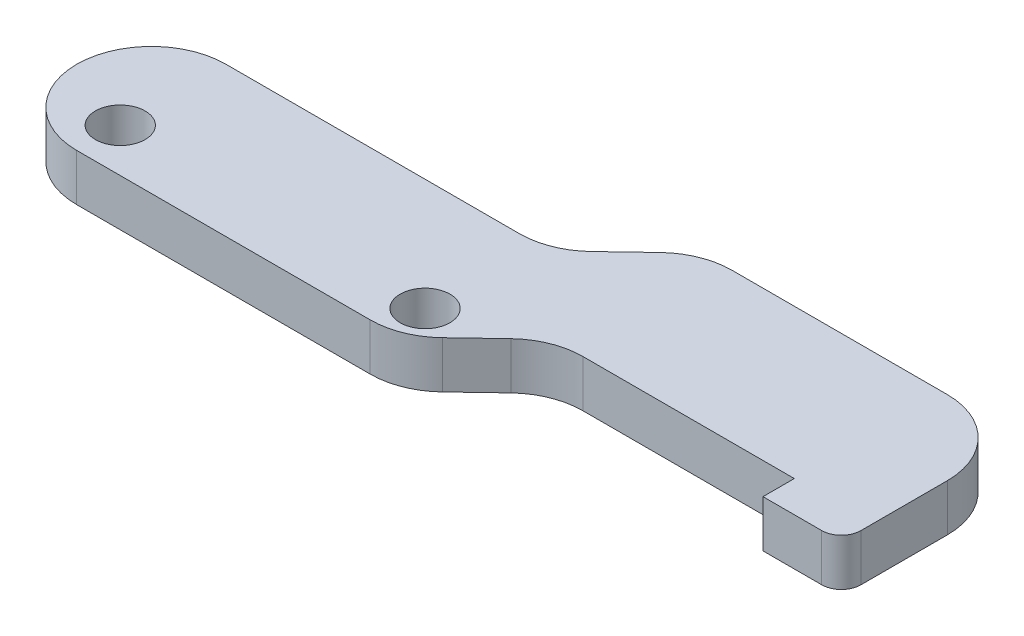
ISO-10303-21;
HEADER;
FILE_DESCRIPTION(('STEP AP214'),'2;1');
FILE_NAME('part.step','',(''),(''),'','','');
FILE_SCHEMA(('AUTOMOTIVE_DESIGN { 1 0 10303 214 1 1 1 1 }'));
ENDSEC;
DATA;
#1=APPLICATION_CONTEXT('core data for automotive mechanical design processes');
#2=APPLICATION_PROTOCOL_DEFINITION('international standard','automotive_design',2000,#1);
#3=PRODUCT_CONTEXT('',#1,'mechanical');
#4=PRODUCT('Part','Part','',(#3));
#5=PRODUCT_RELATED_PRODUCT_CATEGORY('part','',(#4));
#6=PRODUCT_DEFINITION_FORMATION('','',#4);
#7=PRODUCT_DEFINITION_CONTEXT('part definition',#1,'design');
#8=PRODUCT_DEFINITION('design','',#6,#7);
#9=PRODUCT_DEFINITION_SHAPE('','',#8);
#10=(LENGTH_UNIT() NAMED_UNIT(*) SI_UNIT(.MILLI.,.METRE.));
#11=(NAMED_UNIT(*) PLANE_ANGLE_UNIT() SI_UNIT($,.RADIAN.));
#12=(NAMED_UNIT(*) SI_UNIT($,.STERADIAN.) SOLID_ANGLE_UNIT());
#13=UNCERTAINTY_MEASURE_WITH_UNIT(LENGTH_MEASURE(1.E-05),#10,'distance_accuracy_value','');
#14=(GEOMETRIC_REPRESENTATION_CONTEXT(3) GLOBAL_UNCERTAINTY_ASSIGNED_CONTEXT((#13)) GLOBAL_UNIT_ASSIGNED_CONTEXT((#10,
#11,#12)) REPRESENTATION_CONTEXT('',''));
#15=CARTESIAN_POINT('',(0.,0.,0.));
#16=DIRECTION('',(0.,0.,1.));
#17=DIRECTION('',(1.,0.,0.));
#18=AXIS2_PLACEMENT_3D('',#15,#16,#17);
#19=CARTESIAN_POINT('',(0.,37.5,0.));
#20=DIRECTION('',(0.,1.,0.));
#21=DIRECTION('',(0.,0.,1.));
#22=AXIS2_PLACEMENT_3D('',#19,#20,#21);
#23=PLANE('',#22);
#24=CARTESIAN_POINT('',(-257.96875,37.5,0.));
#25=DIRECTION('',(0.,1.,0.));
#26=DIRECTION('',(0.,0.,1.));
#27=AXIS2_PLACEMENT_3D('',#24,#25,#26);
#28=CIRCLE('',#27,19.84375);
#29=CARTESIAN_POINT('',(-257.96875,37.5,19.84375));
#30=VERTEX_POINT('',#29);
#31=EDGE_CURVE('E201',#30,#30,#28,.T.);
#32=ORIENTED_EDGE('',*,*,#31,.F.);
#33=EDGE_LOOP('',(#32));
#34=FACE_BOUND('',#33,.T.);
#35=DIRECTION('',(1.,0.,0.));
#36=VECTOR('',#35,1.);
#37=CARTESIAN_POINT('',(317.5,37.5,0.195312499999996));
#38=LINE('',#37,#36);
#39=CARTESIAN_POINT('',(255.,37.5,0.195312500000003));
#40=VERTEX_POINT('',#39);
#41=CARTESIAN_POINT('',(301.875,37.5,0.195312499999998));
#42=VERTEX_POINT('',#41);
#43=EDGE_CURVE('E181',#40,#42,#38,.T.);
#44=ORIENTED_EDGE('',*,*,#43,.T.);
#45=CARTESIAN_POINT('',(301.875,37.5,-15.4296875));
#46=DIRECTION('',(0.,1.,0.));
#47=DIRECTION('',(0.,0.,1.));
#48=AXIS2_PLACEMENT_3D('',#45,#46,#47);
#49=CIRCLE('',#48,15.625);
#50=CARTESIAN_POINT('',(317.5,37.5,-15.4296875));
#51=VERTEX_POINT('',#50);
#52=EDGE_CURVE('E11',#42,#51,#49,.T.);
#53=ORIENTED_EDGE('',*,*,#52,.T.);
#54=DIRECTION('',(0.,0.,-1.));
#55=VECTOR('',#54,1.);
#56=CARTESIAN_POINT('',(317.5,37.5,-24.8046875));
#57=LINE('',#56,#55);
#58=CARTESIAN_POINT('',(317.5,37.5,-84.3359375));
#59=VERTEX_POINT('',#58);
#60=EDGE_CURVE('E183',#51,#59,#57,.T.);
#61=ORIENTED_EDGE('',*,*,#60,.T.);
#62=CARTESIAN_POINT('',(257.96875,37.5,-84.3359375));
#63=DIRECTION('',(0.,1.,0.));
#64=DIRECTION('',(0.,0.,1.));
#65=AXIS2_PLACEMENT_3D('',#62,#63,#64);
#66=CIRCLE('',#65,59.53125);
#67=CARTESIAN_POINT('',(257.96875,37.5,-143.8671875));
#68=VERTEX_POINT('',#67);
#69=EDGE_CURVE('E248',#59,#68,#66,.T.);
#70=ORIENTED_EDGE('',*,*,#69,.T.);
#71=DIRECTION('',(-1.,0.,0.));
#72=VECTOR('',#71,1.);
#73=CARTESIAN_POINT('',(62.5,37.5,-143.8671875));
#74=LINE('',#73,#72);
#75=CARTESIAN_POINT('',(86.3146553405765,37.5,-143.8671875));
#76=VERTEX_POINT('',#75);
#77=EDGE_CURVE('E188',#68,#76,#74,.T.);
#78=ORIENTED_EDGE('',*,*,#77,.T.);
#79=CARTESIAN_POINT('',(86.3146553405765,37.5,-84.3359375));
#80=DIRECTION('',(0.,1.,0.));
#81=DIRECTION('',(0.,0.,1.));
#82=AXIS2_PLACEMENT_3D('',#79,#80,#81);
#83=CIRCLE('',#82,59.53125);
#84=CARTESIAN_POINT('',(45.2559299992208,37.5,-127.442210824258));
#85=VERTEX_POINT('',#84);
#86=EDGE_CURVE('E250',#76,#85,#83,.T.);
#87=ORIENTED_EDGE('',*,*,#86,.T.);
#88=DIRECTION('',(-0.724094879987533,0.,0.689700373188126));
#89=VECTOR('',#88,1.);
#90=CARTESIAN_POINT('',(0.,37.5,-84.3359375));
#91=LINE('',#90,#89);
#92=CARTESIAN_POINT('',(17.2440700007792,37.5,-100.760914175742));
#93=VERTEX_POINT('',#92);
#94=EDGE_CURVE('E191',#85,#93,#91,.T.);
#95=ORIENTED_EDGE('',*,*,#94,.T.);
#96=CARTESIAN_POINT('',(-23.8146553405764,37.5,-143.8671875));
#97=DIRECTION('',(0.,1.,0.));
#98=DIRECTION('',(0.,0.,1.));
#99=AXIS2_PLACEMENT_3D('',#96,#97,#98);
#100=CIRCLE('',#99,59.53125);
#101=CARTESIAN_POINT('',(-23.8146553405765,37.5,-84.3359375));
#102=VERTEX_POINT('',#101);
#103=EDGE_CURVE('E277',#93,#102,#100,.F.);
#104=ORIENTED_EDGE('',*,*,#103,.T.);
#105=DIRECTION('',(-1.,0.,0.));
#106=VECTOR('',#105,1.);
#107=CARTESIAN_POINT('',(-317.5,37.5,-84.3359375));
#108=LINE('',#107,#106);
#109=CARTESIAN_POINT('',(-257.96875,37.5,-84.3359375));
#110=VERTEX_POINT('',#109);
#111=EDGE_CURVE('E194',#102,#110,#108,.T.);
#112=ORIENTED_EDGE('',*,*,#111,.T.);
#113=CARTESIAN_POINT('',(-257.96875,37.5,-24.8046875));
#114=DIRECTION('',(0.,1.,0.));
#115=DIRECTION('',(0.,0.,1.));
#116=AXIS2_PLACEMENT_3D('',#113,#114,#115);
#117=CIRCLE('',#116,59.53125);
#118=CARTESIAN_POINT('',(-317.5,37.5,-24.8046875));
#119=VERTEX_POINT('',#118);
#120=EDGE_CURVE('E244',#110,#119,#117,.T.);
#121=ORIENTED_EDGE('',*,*,#120,.T.);
#122=CARTESIAN_POINT('',(-257.96875,37.5,-24.8046875));
#123=DIRECTION('',(0.,1.,0.));
#124=DIRECTION('',(0.,0.,1.));
#125=AXIS2_PLACEMENT_3D('',#122,#123,#124);
#126=CIRCLE('',#125,59.53125);
#127=CARTESIAN_POINT('',(-257.96875,37.5,34.7265625));
#128=VERTEX_POINT('',#127);
#129=EDGE_CURVE('E246',#119,#128,#126,.T.);
#130=ORIENTED_EDGE('',*,*,#129,.T.);
#131=DIRECTION('',(1.,0.,0.));
#132=VECTOR('',#131,1.);
#133=CARTESIAN_POINT('',(-317.5,37.5,34.7265625));
#134=LINE('',#133,#132);
#135=CARTESIAN_POINT('',(-23.8146553405765,37.5,34.7265625));
#136=VERTEX_POINT('',#135);
#137=EDGE_CURVE('E220',#128,#136,#134,.T.);
#138=ORIENTED_EDGE('',*,*,#137,.T.);
#139=CARTESIAN_POINT('',(-23.8146553405764,37.5,-24.8046875));
#140=DIRECTION('',(0.,1.,0.));
#141=DIRECTION('',(0.,0.,1.));
#142=AXIS2_PLACEMENT_3D('',#139,#140,#141);
#143=CIRCLE('',#142,59.53125);
#144=CARTESIAN_POINT('',(17.2440700007792,37.5,18.3015858242578));
#145=VERTEX_POINT('',#144);
#146=EDGE_CURVE('E252',#136,#145,#143,.T.);
#147=ORIENTED_EDGE('',*,*,#146,.T.);
#148=DIRECTION('',(0.724094879987533,0.,-0.689700373188125));
#149=VECTOR('',#148,1.);
#150=CARTESIAN_POINT('',(0.,37.5,34.7265625));
#151=LINE('',#150,#149);
#152=CARTESIAN_POINT('',(45.2559299992208,37.5,-8.37971082425783));
#153=VERTEX_POINT('',#152);
#154=EDGE_CURVE('E167',#145,#153,#151,.T.);
#155=ORIENTED_EDGE('',*,*,#154,.T.);
#156=CARTESIAN_POINT('',(86.3146553405764,37.5,34.7265625));
#157=DIRECTION('',(0.,1.,0.));
#158=DIRECTION('',(0.,0.,1.));
#159=AXIS2_PLACEMENT_3D('',#156,#157,#158);
#160=CIRCLE('',#159,59.53125);
#161=CARTESIAN_POINT('',(86.3146553405764,37.5,-24.8046875));
#162=VERTEX_POINT('',#161);
#163=EDGE_CURVE('E163',#153,#162,#160,.F.);
#164=ORIENTED_EDGE('',*,*,#163,.T.);
#165=DIRECTION('',(1.,0.,0.));
#166=VECTOR('',#165,1.);
#167=CARTESIAN_POINT('',(62.5,37.5,-24.8046875));
#168=LINE('',#167,#166);
#169=CARTESIAN_POINT('',(255.,37.5,-24.8046875));
#170=VERTEX_POINT('',#169);
#171=EDGE_CURVE('E155',#162,#170,#168,.T.);
#172=ORIENTED_EDGE('',*,*,#171,.T.);
#173=DIRECTION('',(0.,0.,1.));
#174=VECTOR('',#173,1.);
#175=CARTESIAN_POINT('',(255.,37.5,0.195312500000003));
#176=LINE('',#175,#174);
#177=EDGE_CURVE('E159',#170,#40,#176,.T.);
#178=ORIENTED_EDGE('',*,*,#177,.T.);
#179=EDGE_LOOP('',(#44,#53,#61,#70,#78,#87,#95,#104,#112,#121,#130,#138,#147,#155,#164,#172,#178));
#180=FACE_BOUND('',#179,.T.);
#181=CARTESIAN_POINT('',(-9.83966114808051,37.5,4.9609375));
#182=DIRECTION('',(0.,1.,0.));
#183=DIRECTION('',(0.,0.,1.));
#184=AXIS2_PLACEMENT_3D('',#181,#182,#183);
#185=CIRCLE('',#184,19.84375);
#186=CARTESIAN_POINT('',(-9.83966114808051,37.5,24.8046875));
#187=VERTEX_POINT('',#186);
#188=EDGE_CURVE('E351',#187,#187,#185,.T.);
#189=ORIENTED_EDGE('',*,*,#188,.F.);
#190=EDGE_LOOP('',(#189));
#191=FACE_BOUND('',#190,.T.);
#192=ADVANCED_FACE('F37',(#34,#180,#191),#23,.T.);
#193=CARTESIAN_POINT('',(0.,0.,0.));
#194=DIRECTION('',(0.,1.,0.));
#195=DIRECTION('',(0.,0.,1.));
#196=AXIS2_PLACEMENT_3D('',#193,#194,#195);
#197=PLANE('',#196);
#198=DIRECTION('',(0.,0.,-1.));
#199=VECTOR('',#198,1.);
#200=CARTESIAN_POINT('',(317.5,0.,-24.8046875));
#201=LINE('',#200,#199);
#202=CARTESIAN_POINT('',(317.5,0.,-15.4296875));
#203=VERTEX_POINT('',#202);
#204=CARTESIAN_POINT('',(317.5,0.,-84.3359375));
#205=VERTEX_POINT('',#204);
#206=EDGE_CURVE('E209',#203,#205,#201,.T.);
#207=ORIENTED_EDGE('',*,*,#206,.F.);
#208=CARTESIAN_POINT('',(301.875,0.,-15.4296875));
#209=DIRECTION('',(0.,1.,0.));
#210=DIRECTION('',(0.,0.,1.));
#211=AXIS2_PLACEMENT_3D('',#208,#209,#210);
#212=CIRCLE('',#211,15.625);
#213=CARTESIAN_POINT('',(301.875,0.,0.195312499999998));
#214=VERTEX_POINT('',#213);
#215=EDGE_CURVE('E59',#203,#214,#212,.F.);
#216=ORIENTED_EDGE('',*,*,#215,.T.);
#217=DIRECTION('',(1.,0.,0.));
#218=VECTOR('',#217,1.);
#219=CARTESIAN_POINT('',(317.5,0.,0.195312499999996));
#220=LINE('',#219,#218);
#221=CARTESIAN_POINT('',(255.,0.,0.195312500000003));
#222=VERTEX_POINT('',#221);
#223=EDGE_CURVE('E207',#222,#214,#220,.T.);
#224=ORIENTED_EDGE('',*,*,#223,.F.);
#225=DIRECTION('',(0.,0.,1.));
#226=VECTOR('',#225,1.);
#227=CARTESIAN_POINT('',(255.,0.,0.195312500000003));
#228=LINE('',#227,#226);
#229=CARTESIAN_POINT('',(255.,0.,-24.8046875));
#230=VERTEX_POINT('',#229);
#231=EDGE_CURVE('E205',#230,#222,#228,.T.);
#232=ORIENTED_EDGE('',*,*,#231,.F.);
#233=DIRECTION('',(1.,0.,0.));
#234=VECTOR('',#233,1.);
#235=CARTESIAN_POINT('',(62.5,0.,-24.8046875));
#236=LINE('',#235,#234);
#237=CARTESIAN_POINT('',(86.3146553405764,0.,-24.8046875));
#238=VERTEX_POINT('',#237);
#239=EDGE_CURVE('E173',#238,#230,#236,.T.);
#240=ORIENTED_EDGE('',*,*,#239,.F.);
#241=CARTESIAN_POINT('',(86.3146553405764,0.,34.7265625));
#242=DIRECTION('',(0.,1.,0.));
#243=DIRECTION('',(0.,0.,1.));
#244=AXIS2_PLACEMENT_3D('',#241,#242,#243);
#245=CIRCLE('',#244,59.53125);
#246=CARTESIAN_POINT('',(45.2559299992208,0.,-8.37971082425783));
#247=VERTEX_POINT('',#246);
#248=EDGE_CURVE('E272',#238,#247,#245,.T.);
#249=ORIENTED_EDGE('',*,*,#248,.T.);
#250=DIRECTION('',(0.724094879987533,0.,-0.689700373188125));
#251=VECTOR('',#250,1.);
#252=CARTESIAN_POINT('',(0.,0.,34.7265625));
#253=LINE('',#252,#251);
#254=CARTESIAN_POINT('',(17.2440700007792,0.,18.3015858242578));
#255=VERTEX_POINT('',#254);
#256=EDGE_CURVE('E200',#255,#247,#253,.T.);
#257=ORIENTED_EDGE('',*,*,#256,.F.);
#258=CARTESIAN_POINT('',(-23.8146553405764,0.,-24.8046875));
#259=DIRECTION('',(0.,1.,0.));
#260=DIRECTION('',(0.,0.,1.));
#261=AXIS2_PLACEMENT_3D('',#258,#259,#260);
#262=CIRCLE('',#261,59.53125);
#263=CARTESIAN_POINT('',(-23.8146553405765,0.,34.7265625));
#264=VERTEX_POINT('',#263);
#265=EDGE_CURVE('E237',#255,#264,#262,.F.);
#266=ORIENTED_EDGE('',*,*,#265,.T.);
#267=DIRECTION('',(1.,0.,0.));
#268=VECTOR('',#267,1.);
#269=CARTESIAN_POINT('',(-317.5,0.,34.7265625));
#270=LINE('',#269,#268);
#271=CARTESIAN_POINT('',(-257.96875,0.,34.7265625));
#272=VERTEX_POINT('',#271);
#273=EDGE_CURVE('E197',#272,#264,#270,.T.);
#274=ORIENTED_EDGE('',*,*,#273,.F.);
#275=CARTESIAN_POINT('',(-257.96875,0.,-24.8046875));
#276=DIRECTION('',(0.,1.,0.));
#277=DIRECTION('',(0.,0.,1.));
#278=AXIS2_PLACEMENT_3D('',#275,#276,#277);
#279=CIRCLE('',#278,59.53125);
#280=CARTESIAN_POINT('',(-317.5,0.,-24.8046875));
#281=VERTEX_POINT('',#280);
#282=EDGE_CURVE('E230',#272,#281,#279,.F.);
#283=ORIENTED_EDGE('',*,*,#282,.T.);
#284=CARTESIAN_POINT('',(-257.96875,0.,-24.8046875));
#285=DIRECTION('',(0.,1.,0.));
#286=DIRECTION('',(0.,0.,1.));
#287=AXIS2_PLACEMENT_3D('',#284,#285,#286);
#288=CIRCLE('',#287,59.53125);
#289=CARTESIAN_POINT('',(-257.96875,0.,-84.3359375));
#290=VERTEX_POINT('',#289);
#291=EDGE_CURVE('E228',#281,#290,#288,.F.);
#292=ORIENTED_EDGE('',*,*,#291,.T.);
#293=DIRECTION('',(-1.,0.,0.));
#294=VECTOR('',#293,1.);
#295=CARTESIAN_POINT('',(-317.5,0.,-84.3359375));
#296=LINE('',#295,#294);
#297=CARTESIAN_POINT('',(-23.8146553405765,0.,-84.3359375));
#298=VERTEX_POINT('',#297);
#299=EDGE_CURVE('E217',#298,#290,#296,.T.);
#300=ORIENTED_EDGE('',*,*,#299,.F.);
#301=CARTESIAN_POINT('',(-23.8146553405764,0.,-143.8671875));
#302=DIRECTION('',(0.,1.,0.));
#303=DIRECTION('',(0.,0.,1.));
#304=AXIS2_PLACEMENT_3D('',#301,#302,#303);
#305=CIRCLE('',#304,59.53125);
#306=CARTESIAN_POINT('',(17.2440700007792,0.,-100.760914175742));
#307=VERTEX_POINT('',#306);
#308=EDGE_CURVE('E275',#298,#307,#305,.T.);
#309=ORIENTED_EDGE('',*,*,#308,.T.);
#310=DIRECTION('',(-0.724094879987533,0.,0.689700373188126));
#311=VECTOR('',#310,1.);
#312=CARTESIAN_POINT('',(0.,0.,-84.3359375));
#313=LINE('',#312,#311);
#314=CARTESIAN_POINT('',(45.2559299992208,0.,-127.442210824258));
#315=VERTEX_POINT('',#314);
#316=EDGE_CURVE('E214',#315,#307,#313,.T.);
#317=ORIENTED_EDGE('',*,*,#316,.F.);
#318=CARTESIAN_POINT('',(86.3146553405765,0.,-84.3359375));
#319=DIRECTION('',(0.,1.,0.));
#320=DIRECTION('',(0.,0.,1.));
#321=AXIS2_PLACEMENT_3D('',#318,#319,#320);
#322=CIRCLE('',#321,59.53125);
#323=CARTESIAN_POINT('',(86.3146553405765,0.,-143.8671875));
#324=VERTEX_POINT('',#323);
#325=EDGE_CURVE('E235',#315,#324,#322,.F.);
#326=ORIENTED_EDGE('',*,*,#325,.T.);
#327=DIRECTION('',(-1.,0.,0.));
#328=VECTOR('',#327,1.);
#329=CARTESIAN_POINT('',(62.5,0.,-143.8671875));
#330=LINE('',#329,#328);
#331=CARTESIAN_POINT('',(257.96875,0.,-143.8671875));
#332=VERTEX_POINT('',#331);
#333=EDGE_CURVE('E211',#332,#324,#330,.T.);
#334=ORIENTED_EDGE('',*,*,#333,.F.);
#335=CARTESIAN_POINT('',(257.96875,0.,-84.3359375));
#336=DIRECTION('',(0.,1.,0.));
#337=DIRECTION('',(0.,0.,1.));
#338=AXIS2_PLACEMENT_3D('',#335,#336,#337);
#339=CIRCLE('',#338,59.53125);
#340=EDGE_CURVE('E232',#332,#205,#339,.F.);
#341=ORIENTED_EDGE('',*,*,#340,.T.);
#342=EDGE_LOOP('',(#207,#216,#224,#232,#240,#249,#257,#266,#274,#283,#292,#300,#309,#317,#326,
#334,#341));
#343=FACE_BOUND('',#342,.T.);
#344=CARTESIAN_POINT('',(-257.96875,0.,0.));
#345=DIRECTION('',(0.,1.,0.));
#346=DIRECTION('',(0.,0.,1.));
#347=AXIS2_PLACEMENT_3D('',#344,#345,#346);
#348=CIRCLE('',#347,19.84375);
#349=CARTESIAN_POINT('',(-257.96875,0.,19.84375));
#350=VERTEX_POINT('',#349);
#351=EDGE_CURVE('E348',#350,#350,#348,.T.);
#352=ORIENTED_EDGE('',*,*,#351,.T.);
#353=EDGE_LOOP('',(#352));
#354=FACE_BOUND('',#353,.T.);
#355=CARTESIAN_POINT('',(-9.83966114808051,0.,4.9609375));
#356=DIRECTION('',(0.,1.,0.));
#357=DIRECTION('',(0.,0.,1.));
#358=AXIS2_PLACEMENT_3D('',#355,#356,#357);
#359=CIRCLE('',#358,19.84375);
#360=CARTESIAN_POINT('',(-9.83966114808051,0.,24.8046875));
#361=VERTEX_POINT('',#360);
#362=EDGE_CURVE('E283',#361,#361,#359,.T.);
#363=ORIENTED_EDGE('',*,*,#362,.T.);
#364=EDGE_LOOP('',(#363));
#365=FACE_BOUND('',#364,.T.);
#366=ADVANCED_FACE('F292',(#343,#354,#365),#197,.F.);
#367=CARTESIAN_POINT('',(-317.5,37.5,34.7265625));
#368=DIRECTION('',(0.,0.,-1.));
#369=DIRECTION('',(-1.,0.,0.));
#370=AXIS2_PLACEMENT_3D('',#367,#368,#369);
#371=PLANE('',#370);
#372=ORIENTED_EDGE('',*,*,#273,.T.);
#373=DIRECTION('',(0.,-1.,0.));
#374=VECTOR('',#373,1.);
#375=CARTESIAN_POINT('',(-23.8146553405764,37.5,34.7265625));
#376=LINE('',#375,#374);
#377=EDGE_CURVE('E242',#264,#136,#376,.F.);
#378=ORIENTED_EDGE('',*,*,#377,.T.);
#379=ORIENTED_EDGE('',*,*,#137,.F.);
#380=DIRECTION('',(0.,-1.,0.));
#381=VECTOR('',#380,1.);
#382=CARTESIAN_POINT('',(-257.96875,37.5,34.7265625));
#383=LINE('',#382,#381);
#384=EDGE_CURVE('E239',#128,#272,#383,.T.);
#385=ORIENTED_EDGE('',*,*,#384,.T.);
#386=EDGE_LOOP('',(#372,#378,#379,#385));
#387=FACE_BOUND('',#386,.T.);
#388=ADVANCED_FACE('F334',(#387),#371,.F.);
#389=CARTESIAN_POINT('',(0.,37.5,34.7265625));
#390=DIRECTION('',(-0.689700373188125,0.,-0.724094879987533));
#391=DIRECTION('',(-0.724094879987533,0.,0.689700373188125));
#392=AXIS2_PLACEMENT_3D('',#389,#390,#391);
#393=PLANE('',#392);
#394=ORIENTED_EDGE('',*,*,#256,.T.);
#395=DIRECTION('',(0.,-1.,0.));
#396=VECTOR('',#395,1.);
#397=CARTESIAN_POINT('',(45.2559299992208,37.5,-8.37971082425783));
#398=LINE('',#397,#396);
#399=EDGE_CURVE('E226',#247,#153,#398,.F.);
#400=ORIENTED_EDGE('',*,*,#399,.T.);
#401=ORIENTED_EDGE('',*,*,#154,.F.);
#402=DIRECTION('',(0.,-1.,0.));
#403=VECTOR('',#402,1.);
#404=CARTESIAN_POINT('',(17.2440700007792,37.5,18.3015858242578));
#405=LINE('',#404,#403);
#406=EDGE_CURVE('E223',#145,#255,#405,.T.);
#407=ORIENTED_EDGE('',*,*,#406,.T.);
#408=EDGE_LOOP('',(#394,#400,#401,#407));
#409=FACE_BOUND('',#408,.T.);
#410=ADVANCED_FACE('F345',(#409),#393,.F.);
#411=CARTESIAN_POINT('',(62.5,37.5,-24.8046875));
#412=DIRECTION('',(0.,0.,-1.));
#413=DIRECTION('',(-1.,0.,0.));
#414=AXIS2_PLACEMENT_3D('',#411,#412,#413);
#415=PLANE('',#414);
#416=ORIENTED_EDGE('',*,*,#171,.F.);
#417=DIRECTION('',(0.,-1.,0.));
#418=VECTOR('',#417,1.);
#419=CARTESIAN_POINT('',(86.3146553405764,0.,-24.8046875));
#420=LINE('',#419,#418);
#421=EDGE_CURVE('E176',#162,#238,#420,.T.);
#422=ORIENTED_EDGE('',*,*,#421,.T.);
#423=ORIENTED_EDGE('',*,*,#239,.T.);
#424=DIRECTION('',(0.,-1.,0.));
#425=VECTOR('',#424,1.);
#426=CARTESIAN_POINT('',(255.,37.5,-24.8046875));
#427=LINE('',#426,#425);
#428=EDGE_CURVE('E170',#170,#230,#427,.T.);
#429=ORIENTED_EDGE('',*,*,#428,.F.);
#430=EDGE_LOOP('',(#416,#422,#423,#429));
#431=FACE_BOUND('',#430,.T.);
#432=ADVANCED_FACE('F171',(#431),#415,.F.);
#433=CARTESIAN_POINT('',(255.,37.5,0.195312500000003));
#434=DIRECTION('',(1.,0.,0.));
#435=DIRECTION('',(0.,0.,-1.));
#436=AXIS2_PLACEMENT_3D('',#433,#434,#435);
#437=PLANE('',#436);
#438=ORIENTED_EDGE('',*,*,#231,.T.);
#439=DIRECTION('',(0.,-1.,0.));
#440=VECTOR('',#439,1.);
#441=CARTESIAN_POINT('',(255.,37.5,0.195312500000003));
#442=LINE('',#441,#440);
#443=EDGE_CURVE('E177',#40,#222,#442,.T.);
#444=ORIENTED_EDGE('',*,*,#443,.F.);
#445=ORIENTED_EDGE('',*,*,#177,.F.);
#446=ORIENTED_EDGE('',*,*,#428,.T.);
#447=EDGE_LOOP('',(#438,#444,#445,#446));
#448=FACE_BOUND('',#447,.T.);
#449=ADVANCED_FACE('F179',(#448),#437,.F.);
#450=CARTESIAN_POINT('',(317.5,37.5,0.195312499999996));
#451=DIRECTION('',(0.,0.,-1.));
#452=DIRECTION('',(-1.,0.,0.));
#453=AXIS2_PLACEMENT_3D('',#450,#451,#452);
#454=PLANE('',#453);
#455=ORIENTED_EDGE('',*,*,#223,.T.);
#456=DIRECTION('',(0.,-1.,0.));
#457=VECTOR('',#456,1.);
#458=CARTESIAN_POINT('',(301.875,37.5,0.195312499999998));
#459=LINE('',#458,#457);
#460=EDGE_CURVE('E45',#214,#42,#459,.F.);
#461=ORIENTED_EDGE('',*,*,#460,.T.);
#462=ORIENTED_EDGE('',*,*,#43,.F.);
#463=ORIENTED_EDGE('',*,*,#443,.T.);
#464=EDGE_LOOP('',(#455,#461,#462,#463));
#465=FACE_BOUND('',#464,.T.);
#466=ADVANCED_FACE('F381',(#465),#454,.F.);
#467=CARTESIAN_POINT('',(317.5,37.5,-24.8046875));
#468=DIRECTION('',(-1.,0.,0.));
#469=DIRECTION('',(0.,0.,1.));
#470=AXIS2_PLACEMENT_3D('',#467,#468,#469);
#471=PLANE('',#470);
#472=ORIENTED_EDGE('',*,*,#60,.F.);
#473=DIRECTION('',(0.,-1.,0.));
#474=VECTOR('',#473,1.);
#475=CARTESIAN_POINT('',(317.5,37.5,-15.4296875));
#476=LINE('',#475,#474);
#477=EDGE_CURVE('E279',#51,#203,#476,.T.);
#478=ORIENTED_EDGE('',*,*,#477,.T.);
#479=ORIENTED_EDGE('',*,*,#206,.T.);
#480=DIRECTION('',(0.,-1.,0.));
#481=VECTOR('',#480,1.);
#482=CARTESIAN_POINT('',(317.5,37.5,-84.3359375));
#483=LINE('',#482,#481);
#484=EDGE_CURVE('E269',#205,#59,#483,.F.);
#485=ORIENTED_EDGE('',*,*,#484,.T.);
#486=EDGE_LOOP('',(#472,#478,#479,#485));
#487=FACE_BOUND('',#486,.T.);
#488=ADVANCED_FACE('F289',(#487),#471,.F.);
#489=CARTESIAN_POINT('',(62.5,37.5,-143.8671875));
#490=DIRECTION('',(0.,0.,1.));
#491=DIRECTION('',(1.,0.,0.));
#492=AXIS2_PLACEMENT_3D('',#489,#490,#491);
#493=PLANE('',#492);
#494=ORIENTED_EDGE('',*,*,#333,.T.);
#495=DIRECTION('',(0.,-1.,0.));
#496=VECTOR('',#495,1.);
#497=CARTESIAN_POINT('',(86.3146553405765,37.5,-143.8671875));
#498=LINE('',#497,#496);
#499=EDGE_CURVE('E267',#324,#76,#498,.F.);
#500=ORIENTED_EDGE('',*,*,#499,.T.);
#501=ORIENTED_EDGE('',*,*,#77,.F.);
#502=DIRECTION('',(0.,-1.,0.));
#503=VECTOR('',#502,1.);
#504=CARTESIAN_POINT('',(257.96875,37.5,-143.8671875));
#505=LINE('',#504,#503);
#506=EDGE_CURVE('E264',#68,#332,#505,.T.);
#507=ORIENTED_EDGE('',*,*,#506,.T.);
#508=EDGE_LOOP('',(#494,#500,#501,#507));
#509=FACE_BOUND('',#508,.T.);
#510=ADVANCED_FACE('F303',(#509),#493,.F.);
#511=CARTESIAN_POINT('',(0.,37.5,-84.3359375));
#512=DIRECTION('',(0.689700373188126,0.,0.724094879987533));
#513=DIRECTION('',(0.724094879987533,0.,-0.689700373188126));
#514=AXIS2_PLACEMENT_3D('',#511,#512,#513);
#515=PLANE('',#514);
#516=ORIENTED_EDGE('',*,*,#316,.T.);
#517=DIRECTION('',(0.,-1.,0.));
#518=VECTOR('',#517,1.);
#519=CARTESIAN_POINT('',(17.2440700007792,37.5,-100.760914175742));
#520=LINE('',#519,#518);
#521=EDGE_CURVE('E262',#307,#93,#520,.F.);
#522=ORIENTED_EDGE('',*,*,#521,.T.);
#523=ORIENTED_EDGE('',*,*,#94,.F.);
#524=DIRECTION('',(0.,-1.,0.));
#525=VECTOR('',#524,1.);
#526=CARTESIAN_POINT('',(45.2559299992208,37.5,-127.442210824258));
#527=LINE('',#526,#525);
#528=EDGE_CURVE('E259',#85,#315,#527,.T.);
#529=ORIENTED_EDGE('',*,*,#528,.T.);
#530=EDGE_LOOP('',(#516,#522,#523,#529));
#531=FACE_BOUND('',#530,.T.);
#532=ADVANCED_FACE('F311',(#531),#515,.F.);
#533=CARTESIAN_POINT('',(-317.5,37.5,-84.3359375));
#534=DIRECTION('',(0.,0.,1.));
#535=DIRECTION('',(1.,0.,0.));
#536=AXIS2_PLACEMENT_3D('',#533,#534,#535);
#537=PLANE('',#536);
#538=ORIENTED_EDGE('',*,*,#111,.F.);
#539=DIRECTION('',(0.,-1.,0.));
#540=VECTOR('',#539,1.);
#541=CARTESIAN_POINT('',(-23.8146553405764,0.,-84.3359375));
#542=LINE('',#541,#540);
#543=EDGE_CURVE('E256',#102,#298,#542,.T.);
#544=ORIENTED_EDGE('',*,*,#543,.T.);
#545=ORIENTED_EDGE('',*,*,#299,.T.);
#546=DIRECTION('',(0.,-1.,0.));
#547=VECTOR('',#546,1.);
#548=CARTESIAN_POINT('',(-257.96875,37.5,-84.3359375));
#549=LINE('',#548,#547);
#550=EDGE_CURVE('E254',#290,#110,#549,.F.);
#551=ORIENTED_EDGE('',*,*,#550,.T.);
#552=EDGE_LOOP('',(#538,#544,#545,#551));
#553=FACE_BOUND('',#552,.T.);
#554=ADVANCED_FACE('F320',(#553),#537,.F.);
#555=CARTESIAN_POINT('',(-257.96875,37.5,0.));
#556=DIRECTION('',(0.,-1.,0.));
#557=DIRECTION('',(0.,0.,-1.));
#558=AXIS2_PLACEMENT_3D('',#555,#556,#557);
#559=CYLINDRICAL_SURFACE('',#558,19.84375);
#560=ORIENTED_EDGE('',*,*,#31,.T.);
#561=EDGE_LOOP('',(#560));
#562=FACE_BOUND('',#561,.T.);
#563=ORIENTED_EDGE('',*,*,#351,.F.);
#564=EDGE_LOOP('',(#563));
#565=FACE_BOUND('',#564,.T.);
#566=ADVANCED_FACE('F370',(#562,#565),#559,.F.);
#567=CARTESIAN_POINT('',(-9.83966114808051,37.5,4.9609375));
#568=DIRECTION('',(0.,-1.,0.));
#569=DIRECTION('',(0.,0.,-1.));
#570=AXIS2_PLACEMENT_3D('',#567,#568,#569);
#571=CYLINDRICAL_SURFACE('',#570,19.84375);
#572=ORIENTED_EDGE('',*,*,#188,.T.);
#573=EDGE_LOOP('',(#572));
#574=FACE_BOUND('',#573,.T.);
#575=ORIENTED_EDGE('',*,*,#362,.F.);
#576=EDGE_LOOP('',(#575));
#577=FACE_BOUND('',#576,.T.);
#578=ADVANCED_FACE('F359',(#574,#577),#571,.F.);
#579=CARTESIAN_POINT('',(86.3146553405764,37.5,34.7265625));
#580=DIRECTION('',(0.,1.,0.));
#581=DIRECTION('',(0.,0.,1.));
#582=AXIS2_PLACEMENT_3D('',#579,#580,#581);
#583=CYLINDRICAL_SURFACE('',#582,59.53125);
#584=ORIENTED_EDGE('',*,*,#163,.F.);
#585=ORIENTED_EDGE('',*,*,#399,.F.);
#586=ORIENTED_EDGE('',*,*,#248,.F.);
#587=ORIENTED_EDGE('',*,*,#421,.F.);
#588=EDGE_LOOP('',(#584,#585,#586,#587));
#589=FACE_BOUND('',#588,.T.);
#590=ADVANCED_FACE('F392',(#589),#583,.F.);
#591=CARTESIAN_POINT('',(-23.8146553405764,37.5,-24.8046875));
#592=DIRECTION('',(0.,-1.,0.));
#593=DIRECTION('',(0.,0.,-1.));
#594=AXIS2_PLACEMENT_3D('',#591,#592,#593);
#595=CYLINDRICAL_SURFACE('',#594,59.53125);
#596=ORIENTED_EDGE('',*,*,#146,.F.);
#597=ORIENTED_EDGE('',*,*,#377,.F.);
#598=ORIENTED_EDGE('',*,*,#265,.F.);
#599=ORIENTED_EDGE('',*,*,#406,.F.);
#600=EDGE_LOOP('',(#596,#597,#598,#599));
#601=FACE_BOUND('',#600,.T.);
#602=ADVANCED_FACE('F341',(#601),#595,.T.);
#603=CARTESIAN_POINT('',(-23.8146553405764,37.5,-143.8671875));
#604=DIRECTION('',(0.,1.,0.));
#605=DIRECTION('',(0.,0.,1.));
#606=AXIS2_PLACEMENT_3D('',#603,#604,#605);
#607=CYLINDRICAL_SURFACE('',#606,59.53125);
#608=ORIENTED_EDGE('',*,*,#103,.F.);
#609=ORIENTED_EDGE('',*,*,#521,.F.);
#610=ORIENTED_EDGE('',*,*,#308,.F.);
#611=ORIENTED_EDGE('',*,*,#543,.F.);
#612=EDGE_LOOP('',(#608,#609,#610,#611));
#613=FACE_BOUND('',#612,.T.);
#614=ADVANCED_FACE('F315',(#613),#607,.F.);
#615=CARTESIAN_POINT('',(86.3146553405765,37.5,-84.3359375));
#616=DIRECTION('',(0.,-1.,0.));
#617=DIRECTION('',(0.,0.,-1.));
#618=AXIS2_PLACEMENT_3D('',#615,#616,#617);
#619=CYLINDRICAL_SURFACE('',#618,59.53125);
#620=ORIENTED_EDGE('',*,*,#86,.F.);
#621=ORIENTED_EDGE('',*,*,#499,.F.);
#622=ORIENTED_EDGE('',*,*,#325,.F.);
#623=ORIENTED_EDGE('',*,*,#528,.F.);
#624=EDGE_LOOP('',(#620,#621,#622,#623));
#625=FACE_BOUND('',#624,.T.);
#626=ADVANCED_FACE('F306',(#625),#619,.T.);
#627=CARTESIAN_POINT('',(257.96875,37.5,-84.3359375));
#628=DIRECTION('',(0.,-1.,0.));
#629=DIRECTION('',(0.,0.,-1.));
#630=AXIS2_PLACEMENT_3D('',#627,#628,#629);
#631=CYLINDRICAL_SURFACE('',#630,59.53125);
#632=ORIENTED_EDGE('',*,*,#69,.F.);
#633=ORIENTED_EDGE('',*,*,#484,.F.);
#634=ORIENTED_EDGE('',*,*,#340,.F.);
#635=ORIENTED_EDGE('',*,*,#506,.F.);
#636=EDGE_LOOP('',(#632,#633,#634,#635));
#637=FACE_BOUND('',#636,.T.);
#638=ADVANCED_FACE('F299',(#637),#631,.T.);
#639=CARTESIAN_POINT('',(-257.96875,37.5,-24.8046875));
#640=DIRECTION('',(0.,-1.,0.));
#641=DIRECTION('',(0.,0.,-1.));
#642=AXIS2_PLACEMENT_3D('',#639,#640,#641);
#643=CYLINDRICAL_SURFACE('',#642,59.53125);
#644=DIRECTION('',(0.,-1.,0.));
#645=VECTOR('',#644,1.);
#646=CARTESIAN_POINT('',(-317.5,37.5,-24.8046875));
#647=LINE('',#646,#645);
#648=EDGE_CURVE('E280',#119,#281,#647,.T.);
#649=ORIENTED_EDGE('',*,*,#648,.F.);
#650=ORIENTED_EDGE('',*,*,#120,.F.);
#651=ORIENTED_EDGE('',*,*,#550,.F.);
#652=ORIENTED_EDGE('',*,*,#291,.F.);
#653=EDGE_LOOP('',(#649,#650,#651,#652));
#654=FACE_BOUND('',#653,.T.);
#655=ADVANCED_FACE('F326',(#654),#643,.T.);
#656=CARTESIAN_POINT('',(-257.96875,37.5,-24.8046875));
#657=DIRECTION('',(0.,-1.,0.));
#658=DIRECTION('',(0.,0.,-1.));
#659=AXIS2_PLACEMENT_3D('',#656,#657,#658);
#660=CYLINDRICAL_SURFACE('',#659,59.53125);
#661=ORIENTED_EDGE('',*,*,#129,.F.);
#662=ORIENTED_EDGE('',*,*,#648,.T.);
#663=ORIENTED_EDGE('',*,*,#282,.F.);
#664=ORIENTED_EDGE('',*,*,#384,.F.);
#665=EDGE_LOOP('',(#661,#662,#663,#664));
#666=FACE_BOUND('',#665,.T.);
#667=ADVANCED_FACE('F338',(#666),#660,.T.);
#668=CARTESIAN_POINT('',(301.875,37.5,-15.4296875));
#669=DIRECTION('',(0.,-1.,0.));
#670=DIRECTION('',(0.,0.,-1.));
#671=AXIS2_PLACEMENT_3D('',#668,#669,#670);
#672=CYLINDRICAL_SURFACE('',#671,15.625);
#673=ORIENTED_EDGE('',*,*,#52,.F.);
#674=ORIENTED_EDGE('',*,*,#460,.F.);
#675=ORIENTED_EDGE('',*,*,#215,.F.);
#676=ORIENTED_EDGE('',*,*,#477,.F.);
#677=EDGE_LOOP('',(#673,#674,#675,#676));
#678=FACE_BOUND('',#677,.T.);
#679=ADVANCED_FACE('F39',(#678),#672,.T.);
#680=CLOSED_SHELL('',(#192,#366,#388,#410,#432,#449,#466,#488,#510,#532,#554,#566,#578,#590,
#602,#614,#626,#638,#655,#667,#679));
#681=MANIFOLD_SOLID_BREP('B2',#680);
#682=ADVANCED_BREP_SHAPE_REPRESENTATION('',(#18,#681),#14);
#683=SHAPE_DEFINITION_REPRESENTATION(#9,#682);
ENDSEC;
END-ISO-10303-21;
